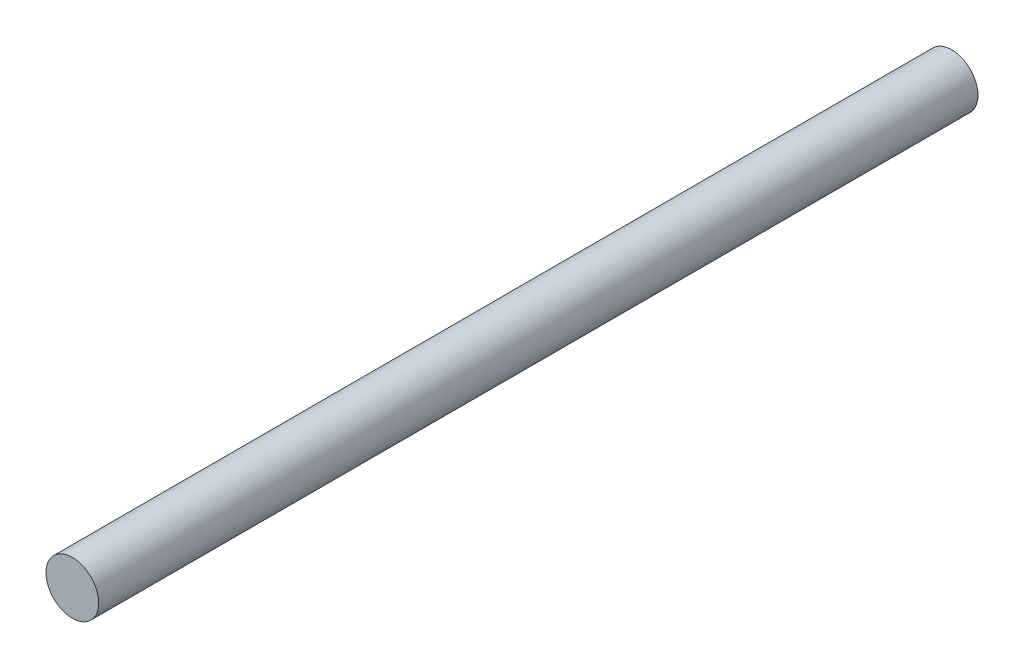
ISO-10303-21;
HEADER;
FILE_DESCRIPTION(('STEP AP214'),'2;1');
FILE_NAME('part.step','',(''),(''),'','','');
FILE_SCHEMA(('AUTOMOTIVE_DESIGN { 1 0 10303 214 1 1 1 1 }'));
ENDSEC;
DATA;
#1=APPLICATION_CONTEXT('core data for automotive mechanical design processes');
#2=APPLICATION_PROTOCOL_DEFINITION('international standard','automotive_design',2000,#1);
#3=PRODUCT_CONTEXT('',#1,'mechanical');
#4=PRODUCT('Part','Part','',(#3));
#5=PRODUCT_RELATED_PRODUCT_CATEGORY('part','',(#4));
#6=PRODUCT_DEFINITION_FORMATION('','',#4);
#7=PRODUCT_DEFINITION_CONTEXT('part definition',#1,'design');
#8=PRODUCT_DEFINITION('design','',#6,#7);
#9=PRODUCT_DEFINITION_SHAPE('','',#8);
#10=(LENGTH_UNIT() NAMED_UNIT(*) SI_UNIT(.MILLI.,.METRE.));
#11=(NAMED_UNIT(*) PLANE_ANGLE_UNIT() SI_UNIT($,.RADIAN.));
#12=(NAMED_UNIT(*) SI_UNIT($,.STERADIAN.) SOLID_ANGLE_UNIT());
#13=UNCERTAINTY_MEASURE_WITH_UNIT(LENGTH_MEASURE(1.E-05),#10,'distance_accuracy_value','');
#14=(GEOMETRIC_REPRESENTATION_CONTEXT(3) GLOBAL_UNCERTAINTY_ASSIGNED_CONTEXT((#13)) GLOBAL_UNIT_ASSIGNED_CONTEXT((#10,
#11,#12)) REPRESENTATION_CONTEXT('',''));
#15=CARTESIAN_POINT('',(0.,0.,0.));
#16=DIRECTION('',(0.,0.,1.));
#17=DIRECTION('',(1.,0.,0.));
#18=AXIS2_PLACEMENT_3D('',#15,#16,#17);
#19=CARTESIAN_POINT('',(0.,0.,250.));
#20=DIRECTION('',(0.,0.,-1.));
#21=DIRECTION('',(-1.,0.,0.));
#22=AXIS2_PLACEMENT_3D('',#19,#20,#21);
#23=CYLINDRICAL_SURFACE('',#22,7.5);
#24=CARTESIAN_POINT('',(0.,0.,250.));
#25=DIRECTION('',(0.,0.,1.));
#26=DIRECTION('',(1.,0.,0.));
#27=AXIS2_PLACEMENT_3D('',#24,#25,#26);
#28=CIRCLE('',#27,7.5);
#29=CARTESIAN_POINT('',(7.5,0.,250.));
#30=VERTEX_POINT('',#29);
#31=EDGE_CURVE('E10',#30,#30,#28,.T.);
#32=ORIENTED_EDGE('',*,*,#31,.F.);
#33=EDGE_LOOP('',(#32));
#34=FACE_BOUND('',#33,.T.);
#35=CARTESIAN_POINT('',(0.,0.,0.));
#36=DIRECTION('',(0.,0.,1.));
#37=DIRECTION('',(1.,0.,0.));
#38=AXIS2_PLACEMENT_3D('',#35,#36,#37);
#39=CIRCLE('',#38,7.5);
#40=CARTESIAN_POINT('',(7.5,0.,0.));
#41=VERTEX_POINT('',#40);
#42=EDGE_CURVE('E44',#41,#41,#39,.T.);
#43=ORIENTED_EDGE('',*,*,#42,.T.);
#44=EDGE_LOOP('',(#43));
#45=FACE_BOUND('',#44,.T.);
#46=ADVANCED_FACE('F41',(#34,#45),#23,.T.);
#47=CARTESIAN_POINT('',(0.,0.,250.));
#48=DIRECTION('',(0.,0.,1.));
#49=DIRECTION('',(1.,0.,0.));
#50=AXIS2_PLACEMENT_3D('',#47,#48,#49);
#51=PLANE('',#50);
#52=ORIENTED_EDGE('',*,*,#31,.T.);
#53=EDGE_LOOP('',(#52));
#54=FACE_BOUND('',#53,.T.);
#55=ADVANCED_FACE('F58',(#54),#51,.T.);
#56=CARTESIAN_POINT('',(0.,0.,0.));
#57=DIRECTION('',(0.,0.,1.));
#58=DIRECTION('',(1.,0.,0.));
#59=AXIS2_PLACEMENT_3D('',#56,#57,#58);
#60=PLANE('',#59);
#61=ORIENTED_EDGE('',*,*,#42,.F.);
#62=EDGE_LOOP('',(#61));
#63=FACE_BOUND('',#62,.T.);
#64=ADVANCED_FACE('F56',(#63),#60,.F.);
#65=CLOSED_SHELL('',(#46,#55,#64));
#66=MANIFOLD_SOLID_BREP('B2',#65);
#67=ADVANCED_BREP_SHAPE_REPRESENTATION('',(#18,#66),#14);
#68=SHAPE_DEFINITION_REPRESENTATION(#9,#67);
ENDSEC;
END-ISO-10303-21;
